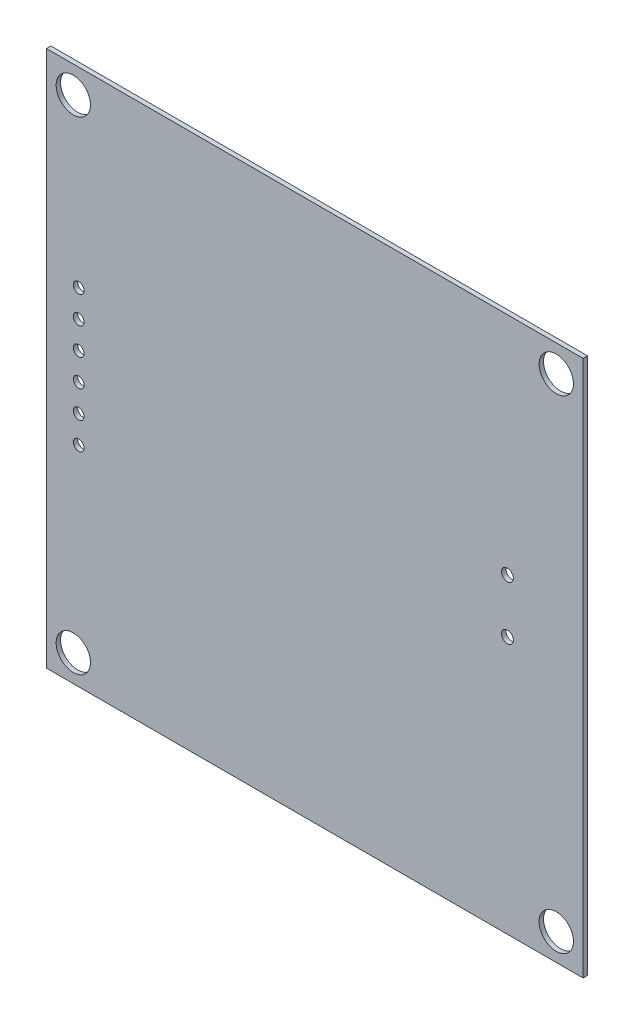
ISO-10303-21;
HEADER;
FILE_DESCRIPTION(('STEP AP214'),'2;1');
FILE_NAME('part.step','',(''),(''),'','','');
FILE_SCHEMA(('AUTOMOTIVE_DESIGN { 1 0 10303 214 1 1 1 1 }'));
ENDSEC;
DATA;
#1=APPLICATION_CONTEXT('core data for automotive mechanical design processes');
#2=APPLICATION_PROTOCOL_DEFINITION('international standard','automotive_design',2000,#1);
#3=PRODUCT_CONTEXT('',#1,'mechanical');
#4=PRODUCT('Part','Part','',(#3));
#5=PRODUCT_RELATED_PRODUCT_CATEGORY('part','',(#4));
#6=PRODUCT_DEFINITION_FORMATION('','',#4);
#7=PRODUCT_DEFINITION_CONTEXT('part definition',#1,'design');
#8=PRODUCT_DEFINITION('design','',#6,#7);
#9=PRODUCT_DEFINITION_SHAPE('','',#8);
#10=(LENGTH_UNIT() NAMED_UNIT(*) SI_UNIT(.MILLI.,.METRE.));
#11=(NAMED_UNIT(*) PLANE_ANGLE_UNIT() SI_UNIT($,.RADIAN.));
#12=(NAMED_UNIT(*) SI_UNIT($,.STERADIAN.) SOLID_ANGLE_UNIT());
#13=UNCERTAINTY_MEASURE_WITH_UNIT(LENGTH_MEASURE(1.E-05),#10,'distance_accuracy_value','');
#14=(GEOMETRIC_REPRESENTATION_CONTEXT(3) GLOBAL_UNCERTAINTY_ASSIGNED_CONTEXT((#13)) GLOBAL_UNIT_ASSIGNED_CONTEXT((#10,
#11,#12)) REPRESENTATION_CONTEXT('',''));
#15=CARTESIAN_POINT('',(0.,0.,0.));
#16=DIRECTION('',(0.,0.,1.));
#17=DIRECTION('',(1.,0.,0.));
#18=AXIS2_PLACEMENT_3D('',#15,#16,#17);
#19=CARTESIAN_POINT('',(27.50000088,27.50000088,0.41148));
#20=DIRECTION('',(0.,0.,-1.));
#21=DIRECTION('',(-1.,0.,0.));
#22=AXIS2_PLACEMENT_3D('',#19,#20,#21);
#23=PLANE('',#22);
#24=CARTESIAN_POINT('',(75.0000024,75.0000024,0.41148));
#25=DIRECTION('',(0.,0.,-1.));
#26=DIRECTION('',(-1.,0.,0.));
#27=AXIS2_PLACEMENT_3D('',#24,#25,#26);
#28=CIRCLE('',#27,1.59999934);
#29=CARTESIAN_POINT('',(73.40000306,75.0000024,0.41148));
#30=VERTEX_POINT('',#29);
#31=EDGE_CURVE('E115',#30,#30,#28,.T.);
#32=ORIENTED_EDGE('',*,*,#31,.T.);
#33=EDGE_LOOP('',(#32));
#34=FACE_BOUND('',#33,.T.);
#35=CARTESIAN_POINT('',(70.4499988,56.500014,0.41148));
#36=DIRECTION('',(0.,0.,-1.));
#37=DIRECTION('',(-1.,0.,0.));
#38=AXIS2_PLACEMENT_3D('',#35,#36,#37);
#39=CIRCLE('',#38,0.5499989);
#40=CARTESIAN_POINT('',(69.8999999,56.500014,0.41148));
#41=VERTEX_POINT('',#40);
#42=EDGE_CURVE('E119',#41,#41,#39,.T.);
#43=ORIENTED_EDGE('',*,*,#42,.T.);
#44=EDGE_LOOP('',(#43));
#45=FACE_BOUND('',#44,.T.);
#46=CARTESIAN_POINT('',(30.5000152,52.0800076,0.41148));
#47=DIRECTION('',(0.,0.,-1.));
#48=DIRECTION('',(-1.,0.,0.));
#49=AXIS2_PLACEMENT_3D('',#46,#47,#48);
#50=CIRCLE('',#49,0.499999);
#51=CARTESIAN_POINT('',(30.0000162,52.0800076,0.41148));
#52=VERTEX_POINT('',#51);
#53=EDGE_CURVE('E122',#52,#52,#50,.T.);
#54=ORIENTED_EDGE('',*,*,#53,.T.);
#55=EDGE_LOOP('',(#54));
#56=FACE_BOUND('',#55,.T.);
#57=CARTESIAN_POINT('',(70.4499988,51.500024,0.41148));
#58=DIRECTION('',(0.,0.,-1.));
#59=DIRECTION('',(-1.,0.,0.));
#60=AXIS2_PLACEMENT_3D('',#57,#58,#59);
#61=CIRCLE('',#60,0.5499989);
#62=CARTESIAN_POINT('',(69.8999999,51.500024,0.41148));
#63=VERTEX_POINT('',#62);
#64=EDGE_CURVE('E125',#63,#63,#61,.T.);
#65=ORIENTED_EDGE('',*,*,#64,.T.);
#66=EDGE_LOOP('',(#65));
#67=FACE_BOUND('',#66,.T.);
#68=CARTESIAN_POINT('',(75.0000024,29.9999908,0.41148));
#69=DIRECTION('',(0.,0.,-1.));
#70=DIRECTION('',(-1.,0.,0.));
#71=AXIS2_PLACEMENT_3D('',#68,#69,#70);
#72=CIRCLE('',#71,1.59999934);
#73=CARTESIAN_POINT('',(73.40000306,29.9999908,0.41148));
#74=VERTEX_POINT('',#73);
#75=EDGE_CURVE('E128',#74,#74,#72,.T.);
#76=ORIENTED_EDGE('',*,*,#75,.T.);
#77=EDGE_LOOP('',(#76));
#78=FACE_BOUND('',#77,.T.);
#79=CARTESIAN_POINT('',(30.5000152,47.0000076,0.41148));
#80=DIRECTION('',(0.,0.,-1.));
#81=DIRECTION('',(-1.,0.,0.));
#82=AXIS2_PLACEMENT_3D('',#79,#80,#81);
#83=CIRCLE('',#82,0.499999);
#84=CARTESIAN_POINT('',(30.0000162,47.0000076,0.41148));
#85=VERTEX_POINT('',#84);
#86=EDGE_CURVE('E131',#85,#85,#83,.T.);
#87=ORIENTED_EDGE('',*,*,#86,.T.);
#88=EDGE_LOOP('',(#87));
#89=FACE_BOUND('',#88,.T.);
#90=CARTESIAN_POINT('',(29.9999908,75.0000024,0.41148));
#91=DIRECTION('',(0.,0.,-1.));
#92=DIRECTION('',(-1.,0.,0.));
#93=AXIS2_PLACEMENT_3D('',#90,#91,#92);
#94=CIRCLE('',#93,1.59999934);
#95=CARTESIAN_POINT('',(28.39999146,75.0000024,0.41148));
#96=VERTEX_POINT('',#95);
#97=EDGE_CURVE('E134',#96,#96,#94,.T.);
#98=ORIENTED_EDGE('',*,*,#97,.T.);
#99=EDGE_LOOP('',(#98));
#100=FACE_BOUND('',#99,.T.);
#101=CARTESIAN_POINT('',(30.5000152,59.7000076,0.41148));
#102=DIRECTION('',(0.,0.,-1.));
#103=DIRECTION('',(-1.,0.,0.));
#104=AXIS2_PLACEMENT_3D('',#101,#102,#103);
#105=CIRCLE('',#104,0.499999);
#106=CARTESIAN_POINT('',(30.0000162,59.7000076,0.41148));
#107=VERTEX_POINT('',#106);
#108=EDGE_CURVE('E137',#107,#107,#105,.T.);
#109=ORIENTED_EDGE('',*,*,#108,.T.);
#110=EDGE_LOOP('',(#109));
#111=FACE_BOUND('',#110,.T.);
#112=CARTESIAN_POINT('',(30.5000152,57.1600076,0.41148));
#113=DIRECTION('',(0.,0.,-1.));
#114=DIRECTION('',(-1.,0.,0.));
#115=AXIS2_PLACEMENT_3D('',#112,#113,#114);
#116=CIRCLE('',#115,0.499999);
#117=CARTESIAN_POINT('',(30.0000162,57.1600076,0.41148));
#118=VERTEX_POINT('',#117);
#119=EDGE_CURVE('E140',#118,#118,#116,.T.);
#120=ORIENTED_EDGE('',*,*,#119,.T.);
#121=EDGE_LOOP('',(#120));
#122=FACE_BOUND('',#121,.T.);
#123=CARTESIAN_POINT('',(30.5000152,49.5400076,0.41148));
#124=DIRECTION('',(0.,0.,-1.));
#125=DIRECTION('',(-1.,0.,0.));
#126=AXIS2_PLACEMENT_3D('',#123,#124,#125);
#127=CIRCLE('',#126,0.499999);
#128=CARTESIAN_POINT('',(30.0000162,49.5400076,0.41148));
#129=VERTEX_POINT('',#128);
#130=EDGE_CURVE('E143',#129,#129,#127,.T.);
#131=ORIENTED_EDGE('',*,*,#130,.T.);
#132=EDGE_LOOP('',(#131));
#133=FACE_BOUND('',#132,.T.);
#134=CARTESIAN_POINT('',(29.9999908,29.9999908,0.41148));
#135=DIRECTION('',(0.,0.,-1.));
#136=DIRECTION('',(-1.,0.,0.));
#137=AXIS2_PLACEMENT_3D('',#134,#135,#136);
#138=CIRCLE('',#137,1.59999934);
#139=CARTESIAN_POINT('',(28.39999146,29.9999908,0.41148));
#140=VERTEX_POINT('',#139);
#141=EDGE_CURVE('E145',#140,#140,#138,.T.);
#142=ORIENTED_EDGE('',*,*,#141,.T.);
#143=EDGE_LOOP('',(#142));
#144=FACE_BOUND('',#143,.T.);
#145=CARTESIAN_POINT('',(30.5000152,54.6200076,0.41148));
#146=DIRECTION('',(0.,0.,-1.));
#147=DIRECTION('',(-1.,0.,0.));
#148=AXIS2_PLACEMENT_3D('',#145,#146,#147);
#149=CIRCLE('',#148,0.499999);
#150=CARTESIAN_POINT('',(30.0000162,54.6200076,0.41148));
#151=VERTEX_POINT('',#150);
#152=EDGE_CURVE('E20',#151,#151,#149,.T.);
#153=ORIENTED_EDGE('',*,*,#152,.T.);
#154=EDGE_LOOP('',(#153));
#155=FACE_BOUND('',#154,.T.);
#156=DIRECTION('',(0.,1.,0.));
#157=VECTOR('',#156,1.);
#158=CARTESIAN_POINT('',(77.49999994,27.50000088,0.41148));
#159=LINE('',#158,#157);
#160=CARTESIAN_POINT('',(77.49999994,27.50000088,0.41148));
#161=VERTEX_POINT('',#160);
#162=CARTESIAN_POINT('',(77.49999994,77.49999994,0.41148));
#163=VERTEX_POINT('',#162);
#164=EDGE_CURVE('E55',#161,#163,#159,.T.);
#165=ORIENTED_EDGE('',*,*,#164,.T.);
#166=DIRECTION('',(1.,0.,0.));
#167=VECTOR('',#166,1.);
#168=CARTESIAN_POINT('',(77.49999994,77.49999994,0.41148));
#169=LINE('',#168,#167);
#170=CARTESIAN_POINT('',(27.50000088,77.49999994,0.41148));
#171=VERTEX_POINT('',#170);
#172=EDGE_CURVE('E57',#163,#171,#169,.F.);
#173=ORIENTED_EDGE('',*,*,#172,.T.);
#174=DIRECTION('',(0.,1.,0.));
#175=VECTOR('',#174,1.);
#176=CARTESIAN_POINT('',(27.50000088,77.49999994,0.41148));
#177=LINE('',#176,#175);
#178=CARTESIAN_POINT('',(27.50000088,27.50000088,0.41148));
#179=VERTEX_POINT('',#178);
#180=EDGE_CURVE('E59',#171,#179,#177,.F.);
#181=ORIENTED_EDGE('',*,*,#180,.T.);
#182=DIRECTION('',(1.,0.,0.));
#183=VECTOR('',#182,1.);
#184=CARTESIAN_POINT('',(27.50000088,27.50000088,0.41148));
#185=LINE('',#184,#183);
#186=EDGE_CURVE('E152',#179,#161,#185,.T.);
#187=ORIENTED_EDGE('',*,*,#186,.T.);
#188=EDGE_LOOP('',(#165,#173,#181,#187));
#189=FACE_BOUND('',#188,.T.);
#190=ADVANCED_FACE('F17',(#34,#45,#56,#67,#78,#89,#100,#111,#122,#133,#144,#155,#189),#23,.F.);
#191=CARTESIAN_POINT('',(27.50000088,77.49999994,0.));
#192=DIRECTION('',(1.,0.,0.));
#193=DIRECTION('',(0.,0.,-1.));
#194=AXIS2_PLACEMENT_3D('',#191,#192,#193);
#195=PLANE('',#194);
#196=DIRECTION('',(0.,0.,1.));
#197=VECTOR('',#196,1.);
#198=CARTESIAN_POINT('',(27.50000088,27.50000088,0.));
#199=LINE('',#198,#197);
#200=CARTESIAN_POINT('',(27.50000088,27.50000088,0.));
#201=VERTEX_POINT('',#200);
#202=EDGE_CURVE('E70',#201,#179,#199,.T.);
#203=ORIENTED_EDGE('',*,*,#202,.T.);
#204=ORIENTED_EDGE('',*,*,#180,.F.);
#205=DIRECTION('',(0.,0.,-1.));
#206=VECTOR('',#205,1.);
#207=CARTESIAN_POINT('',(27.50000088,77.49999994,0.));
#208=LINE('',#207,#206);
#209=CARTESIAN_POINT('',(27.50000088,77.49999994,0.));
#210=VERTEX_POINT('',#209);
#211=EDGE_CURVE('E64',#171,#210,#208,.T.);
#212=ORIENTED_EDGE('',*,*,#211,.T.);
#213=DIRECTION('',(0.,1.,0.));
#214=VECTOR('',#213,1.);
#215=CARTESIAN_POINT('',(27.50000088,27.50000088,0.));
#216=LINE('',#215,#214);
#217=EDGE_CURVE('E118',#201,#210,#216,.T.);
#218=ORIENTED_EDGE('',*,*,#217,.F.);
#219=EDGE_LOOP('',(#203,#204,#212,#218));
#220=FACE_BOUND('',#219,.T.);
#221=ADVANCED_FACE('F67',(#220),#195,.F.);
#222=CARTESIAN_POINT('',(77.49999994,77.49999994,0.));
#223=DIRECTION('',(0.,-1.,0.));
#224=DIRECTION('',(0.,0.,-1.));
#225=AXIS2_PLACEMENT_3D('',#222,#223,#224);
#226=PLANE('',#225);
#227=ORIENTED_EDGE('',*,*,#211,.F.);
#228=ORIENTED_EDGE('',*,*,#172,.F.);
#229=DIRECTION('',(0.,0.,1.));
#230=VECTOR('',#229,1.);
#231=CARTESIAN_POINT('',(77.49999994,77.49999994,0.));
#232=LINE('',#231,#230);
#233=CARTESIAN_POINT('',(77.49999994,77.49999994,0.));
#234=VERTEX_POINT('',#233);
#235=EDGE_CURVE('E78',#163,#234,#232,.F.);
#236=ORIENTED_EDGE('',*,*,#235,.T.);
#237=DIRECTION('',(-1.,0.,0.));
#238=VECTOR('',#237,1.);
#239=CARTESIAN_POINT('',(27.50000088,77.49999994,0.));
#240=LINE('',#239,#238);
#241=EDGE_CURVE('E75',#210,#234,#240,.F.);
#242=ORIENTED_EDGE('',*,*,#241,.F.);
#243=EDGE_LOOP('',(#227,#228,#236,#242));
#244=FACE_BOUND('',#243,.T.);
#245=ADVANCED_FACE('F73',(#244),#226,.F.);
#246=CARTESIAN_POINT('',(77.49999994,27.50000088,0.));
#247=DIRECTION('',(-1.,0.,0.));
#248=DIRECTION('',(0.,0.,1.));
#249=AXIS2_PLACEMENT_3D('',#246,#247,#248);
#250=PLANE('',#249);
#251=ORIENTED_EDGE('',*,*,#235,.F.);
#252=ORIENTED_EDGE('',*,*,#164,.F.);
#253=DIRECTION('',(0.,0.,1.));
#254=VECTOR('',#253,1.);
#255=CARTESIAN_POINT('',(77.49999994,27.50000088,0.));
#256=LINE('',#255,#254);
#257=CARTESIAN_POINT('',(77.49999994,27.50000088,0.));
#258=VERTEX_POINT('',#257);
#259=EDGE_CURVE('E35',#161,#258,#256,.F.);
#260=ORIENTED_EDGE('',*,*,#259,.T.);
#261=DIRECTION('',(0.,1.,0.));
#262=VECTOR('',#261,1.);
#263=CARTESIAN_POINT('',(77.49999994,27.50000088,0.));
#264=LINE('',#263,#262);
#265=EDGE_CURVE('E159',#234,#258,#264,.F.);
#266=ORIENTED_EDGE('',*,*,#265,.F.);
#267=EDGE_LOOP('',(#251,#252,#260,#266));
#268=FACE_BOUND('',#267,.T.);
#269=ADVANCED_FACE('F160',(#268),#250,.F.);
#270=CARTESIAN_POINT('',(27.50000088,27.50000088,0.));
#271=DIRECTION('',(0.,1.,0.));
#272=DIRECTION('',(0.,0.,1.));
#273=AXIS2_PLACEMENT_3D('',#270,#271,#272);
#274=PLANE('',#273);
#275=ORIENTED_EDGE('',*,*,#259,.F.);
#276=ORIENTED_EDGE('',*,*,#186,.F.);
#277=ORIENTED_EDGE('',*,*,#202,.F.);
#278=DIRECTION('',(-1.,0.,0.));
#279=VECTOR('',#278,1.);
#280=CARTESIAN_POINT('',(27.50000088,27.50000088,0.));
#281=LINE('',#280,#279);
#282=EDGE_CURVE('E114',#258,#201,#281,.T.);
#283=ORIENTED_EDGE('',*,*,#282,.F.);
#284=EDGE_LOOP('',(#275,#276,#277,#283));
#285=FACE_BOUND('',#284,.T.);
#286=ADVANCED_FACE('F167',(#285),#274,.F.);
#287=CARTESIAN_POINT('',(30.5000152,54.6200076,0.));
#288=DIRECTION('',(0.,0.,-1.));
#289=DIRECTION('',(-1.,0.,0.));
#290=AXIS2_PLACEMENT_3D('',#287,#288,#289);
#291=CYLINDRICAL_SURFACE('',#290,0.499999);
#292=ORIENTED_EDGE('',*,*,#152,.F.);
#293=EDGE_LOOP('',(#292));
#294=FACE_BOUND('',#293,.T.);
#295=CARTESIAN_POINT('',(30.5000152,54.6200076,0.));
#296=DIRECTION('',(0.,0.,-1.));
#297=DIRECTION('',(-1.,0.,0.));
#298=AXIS2_PLACEMENT_3D('',#295,#296,#297);
#299=CIRCLE('',#298,0.499999);
#300=CARTESIAN_POINT('',(30.0000162,54.6200076,0.));
#301=VERTEX_POINT('',#300);
#302=EDGE_CURVE('E111',#301,#301,#299,.F.);
#303=ORIENTED_EDGE('',*,*,#302,.F.);
#304=EDGE_LOOP('',(#303));
#305=FACE_BOUND('',#304,.T.);
#306=ADVANCED_FACE('F169',(#294,#305),#291,.F.);
#307=CARTESIAN_POINT('',(29.9999908,29.9999908,0.));
#308=DIRECTION('',(0.,0.,-1.));
#309=DIRECTION('',(-1.,0.,0.));
#310=AXIS2_PLACEMENT_3D('',#307,#308,#309);
#311=CYLINDRICAL_SURFACE('',#310,1.59999934);
#312=ORIENTED_EDGE('',*,*,#141,.F.);
#313=EDGE_LOOP('',(#312));
#314=FACE_BOUND('',#313,.T.);
#315=CARTESIAN_POINT('',(29.9999908,29.9999908,0.));
#316=DIRECTION('',(0.,0.,-1.));
#317=DIRECTION('',(-1.,0.,0.));
#318=AXIS2_PLACEMENT_3D('',#315,#316,#317);
#319=CIRCLE('',#318,1.59999934);
#320=CARTESIAN_POINT('',(28.39999146,29.9999908,0.));
#321=VERTEX_POINT('',#320);
#322=EDGE_CURVE('E108',#321,#321,#319,.F.);
#323=ORIENTED_EDGE('',*,*,#322,.F.);
#324=EDGE_LOOP('',(#323));
#325=FACE_BOUND('',#324,.T.);
#326=ADVANCED_FACE('F176',(#314,#325),#311,.F.);
#327=CARTESIAN_POINT('',(30.5000152,49.5400076,0.));
#328=DIRECTION('',(0.,0.,-1.));
#329=DIRECTION('',(-1.,0.,0.));
#330=AXIS2_PLACEMENT_3D('',#327,#328,#329);
#331=CYLINDRICAL_SURFACE('',#330,0.499999);
#332=ORIENTED_EDGE('',*,*,#130,.F.);
#333=EDGE_LOOP('',(#332));
#334=FACE_BOUND('',#333,.T.);
#335=CARTESIAN_POINT('',(30.5000152,49.5400076,0.));
#336=DIRECTION('',(0.,0.,-1.));
#337=DIRECTION('',(-1.,0.,0.));
#338=AXIS2_PLACEMENT_3D('',#335,#336,#337);
#339=CIRCLE('',#338,0.499999);
#340=CARTESIAN_POINT('',(30.0000162,49.5400076,0.));
#341=VERTEX_POINT('',#340);
#342=EDGE_CURVE('E105',#341,#341,#339,.F.);
#343=ORIENTED_EDGE('',*,*,#342,.F.);
#344=EDGE_LOOP('',(#343));
#345=FACE_BOUND('',#344,.T.);
#346=ADVANCED_FACE('F222',(#334,#345),#331,.F.);
#347=CARTESIAN_POINT('',(30.5000152,57.1600076,0.));
#348=DIRECTION('',(0.,0.,-1.));
#349=DIRECTION('',(-1.,0.,0.));
#350=AXIS2_PLACEMENT_3D('',#347,#348,#349);
#351=CYLINDRICAL_SURFACE('',#350,0.499999);
#352=ORIENTED_EDGE('',*,*,#119,.F.);
#353=EDGE_LOOP('',(#352));
#354=FACE_BOUND('',#353,.T.);
#355=CARTESIAN_POINT('',(30.5000152,57.1600076,0.));
#356=DIRECTION('',(0.,0.,-1.));
#357=DIRECTION('',(-1.,0.,0.));
#358=AXIS2_PLACEMENT_3D('',#355,#356,#357);
#359=CIRCLE('',#358,0.499999);
#360=CARTESIAN_POINT('',(30.0000162,57.1600076,0.));
#361=VERTEX_POINT('',#360);
#362=EDGE_CURVE('E102',#361,#361,#359,.F.);
#363=ORIENTED_EDGE('',*,*,#362,.F.);
#364=EDGE_LOOP('',(#363));
#365=FACE_BOUND('',#364,.T.);
#366=ADVANCED_FACE('F218',(#354,#365),#351,.F.);
#367=CARTESIAN_POINT('',(30.5000152,59.7000076,0.));
#368=DIRECTION('',(0.,0.,-1.));
#369=DIRECTION('',(-1.,0.,0.));
#370=AXIS2_PLACEMENT_3D('',#367,#368,#369);
#371=CYLINDRICAL_SURFACE('',#370,0.499999);
#372=ORIENTED_EDGE('',*,*,#108,.F.);
#373=EDGE_LOOP('',(#372));
#374=FACE_BOUND('',#373,.T.);
#375=CARTESIAN_POINT('',(30.5000152,59.7000076,0.));
#376=DIRECTION('',(0.,0.,-1.));
#377=DIRECTION('',(-1.,0.,0.));
#378=AXIS2_PLACEMENT_3D('',#375,#376,#377);
#379=CIRCLE('',#378,0.499999);
#380=CARTESIAN_POINT('',(30.0000162,59.7000076,0.));
#381=VERTEX_POINT('',#380);
#382=EDGE_CURVE('E99',#381,#381,#379,.F.);
#383=ORIENTED_EDGE('',*,*,#382,.F.);
#384=EDGE_LOOP('',(#383));
#385=FACE_BOUND('',#384,.T.);
#386=ADVANCED_FACE('F214',(#374,#385),#371,.F.);
#387=CARTESIAN_POINT('',(29.9999908,75.0000024,0.));
#388=DIRECTION('',(0.,0.,-1.));
#389=DIRECTION('',(-1.,0.,0.));
#390=AXIS2_PLACEMENT_3D('',#387,#388,#389);
#391=CYLINDRICAL_SURFACE('',#390,1.59999934);
#392=ORIENTED_EDGE('',*,*,#97,.F.);
#393=EDGE_LOOP('',(#392));
#394=FACE_BOUND('',#393,.T.);
#395=CARTESIAN_POINT('',(29.9999908,75.0000024,0.));
#396=DIRECTION('',(0.,0.,-1.));
#397=DIRECTION('',(-1.,0.,0.));
#398=AXIS2_PLACEMENT_3D('',#395,#396,#397);
#399=CIRCLE('',#398,1.59999934);
#400=CARTESIAN_POINT('',(28.39999146,75.0000024,0.));
#401=VERTEX_POINT('',#400);
#402=EDGE_CURVE('E96',#401,#401,#399,.F.);
#403=ORIENTED_EDGE('',*,*,#402,.F.);
#404=EDGE_LOOP('',(#403));
#405=FACE_BOUND('',#404,.T.);
#406=ADVANCED_FACE('F210',(#394,#405),#391,.F.);
#407=CARTESIAN_POINT('',(30.5000152,47.0000076,0.));
#408=DIRECTION('',(0.,0.,-1.));
#409=DIRECTION('',(-1.,0.,0.));
#410=AXIS2_PLACEMENT_3D('',#407,#408,#409);
#411=CYLINDRICAL_SURFACE('',#410,0.499999);
#412=ORIENTED_EDGE('',*,*,#86,.F.);
#413=EDGE_LOOP('',(#412));
#414=FACE_BOUND('',#413,.T.);
#415=CARTESIAN_POINT('',(30.5000152,47.0000076,0.));
#416=DIRECTION('',(0.,0.,-1.));
#417=DIRECTION('',(-1.,0.,0.));
#418=AXIS2_PLACEMENT_3D('',#415,#416,#417);
#419=CIRCLE('',#418,0.499999);
#420=CARTESIAN_POINT('',(30.0000162,47.0000076,0.));
#421=VERTEX_POINT('',#420);
#422=EDGE_CURVE('E93',#421,#421,#419,.F.);
#423=ORIENTED_EDGE('',*,*,#422,.F.);
#424=EDGE_LOOP('',(#423));
#425=FACE_BOUND('',#424,.T.);
#426=ADVANCED_FACE('F206',(#414,#425),#411,.F.);
#427=CARTESIAN_POINT('',(75.0000024,29.9999908,0.));
#428=DIRECTION('',(0.,0.,-1.));
#429=DIRECTION('',(-1.,0.,0.));
#430=AXIS2_PLACEMENT_3D('',#427,#428,#429);
#431=CYLINDRICAL_SURFACE('',#430,1.59999934);
#432=ORIENTED_EDGE('',*,*,#75,.F.);
#433=EDGE_LOOP('',(#432));
#434=FACE_BOUND('',#433,.T.);
#435=CARTESIAN_POINT('',(75.0000024,29.9999908,0.));
#436=DIRECTION('',(0.,0.,-1.));
#437=DIRECTION('',(-1.,0.,0.));
#438=AXIS2_PLACEMENT_3D('',#435,#436,#437);
#439=CIRCLE('',#438,1.59999934);
#440=CARTESIAN_POINT('',(73.40000306,29.9999908,0.));
#441=VERTEX_POINT('',#440);
#442=EDGE_CURVE('E90',#441,#441,#439,.F.);
#443=ORIENTED_EDGE('',*,*,#442,.F.);
#444=EDGE_LOOP('',(#443));
#445=FACE_BOUND('',#444,.T.);
#446=ADVANCED_FACE('F202',(#434,#445),#431,.F.);
#447=CARTESIAN_POINT('',(70.4499988,51.500024,0.));
#448=DIRECTION('',(0.,0.,-1.));
#449=DIRECTION('',(-1.,0.,0.));
#450=AXIS2_PLACEMENT_3D('',#447,#448,#449);
#451=CYLINDRICAL_SURFACE('',#450,0.5499989);
#452=ORIENTED_EDGE('',*,*,#64,.F.);
#453=EDGE_LOOP('',(#452));
#454=FACE_BOUND('',#453,.T.);
#455=CARTESIAN_POINT('',(70.4499988,51.500024,0.));
#456=DIRECTION('',(0.,0.,-1.));
#457=DIRECTION('',(-1.,0.,0.));
#458=AXIS2_PLACEMENT_3D('',#455,#456,#457);
#459=CIRCLE('',#458,0.5499989);
#460=CARTESIAN_POINT('',(69.8999999,51.500024,0.));
#461=VERTEX_POINT('',#460);
#462=EDGE_CURVE('E87',#461,#461,#459,.F.);
#463=ORIENTED_EDGE('',*,*,#462,.F.);
#464=EDGE_LOOP('',(#463));
#465=FACE_BOUND('',#464,.T.);
#466=ADVANCED_FACE('F198',(#454,#465),#451,.F.);
#467=CARTESIAN_POINT('',(30.5000152,52.0800076,0.));
#468=DIRECTION('',(0.,0.,-1.));
#469=DIRECTION('',(-1.,0.,0.));
#470=AXIS2_PLACEMENT_3D('',#467,#468,#469);
#471=CYLINDRICAL_SURFACE('',#470,0.499999);
#472=ORIENTED_EDGE('',*,*,#53,.F.);
#473=EDGE_LOOP('',(#472));
#474=FACE_BOUND('',#473,.T.);
#475=CARTESIAN_POINT('',(30.5000152,52.0800076,0.));
#476=DIRECTION('',(0.,0.,-1.));
#477=DIRECTION('',(-1.,0.,0.));
#478=AXIS2_PLACEMENT_3D('',#475,#476,#477);
#479=CIRCLE('',#478,0.499999);
#480=CARTESIAN_POINT('',(30.0000162,52.0800076,0.));
#481=VERTEX_POINT('',#480);
#482=EDGE_CURVE('E84',#481,#481,#479,.F.);
#483=ORIENTED_EDGE('',*,*,#482,.F.);
#484=EDGE_LOOP('',(#483));
#485=FACE_BOUND('',#484,.T.);
#486=ADVANCED_FACE('F194',(#474,#485),#471,.F.);
#487=CARTESIAN_POINT('',(70.4499988,56.500014,0.));
#488=DIRECTION('',(0.,0.,-1.));
#489=DIRECTION('',(-1.,0.,0.));
#490=AXIS2_PLACEMENT_3D('',#487,#488,#489);
#491=CYLINDRICAL_SURFACE('',#490,0.5499989);
#492=ORIENTED_EDGE('',*,*,#42,.F.);
#493=EDGE_LOOP('',(#492));
#494=FACE_BOUND('',#493,.T.);
#495=CARTESIAN_POINT('',(70.4499988,56.500014,0.));
#496=DIRECTION('',(0.,0.,-1.));
#497=DIRECTION('',(-1.,0.,0.));
#498=AXIS2_PLACEMENT_3D('',#495,#496,#497);
#499=CIRCLE('',#498,0.5499989);
#500=CARTESIAN_POINT('',(69.8999999,56.500014,0.));
#501=VERTEX_POINT('',#500);
#502=EDGE_CURVE('E26',#501,#501,#499,.F.);
#503=ORIENTED_EDGE('',*,*,#502,.F.);
#504=EDGE_LOOP('',(#503));
#505=FACE_BOUND('',#504,.T.);
#506=ADVANCED_FACE('F187',(#494,#505),#491,.F.);
#507=CARTESIAN_POINT('',(75.0000024,75.0000024,0.));
#508=DIRECTION('',(0.,0.,-1.));
#509=DIRECTION('',(-1.,0.,0.));
#510=AXIS2_PLACEMENT_3D('',#507,#508,#509);
#511=CYLINDRICAL_SURFACE('',#510,1.59999934);
#512=ORIENTED_EDGE('',*,*,#31,.F.);
#513=EDGE_LOOP('',(#512));
#514=FACE_BOUND('',#513,.T.);
#515=CARTESIAN_POINT('',(75.0000024,75.0000024,0.));
#516=DIRECTION('',(0.,0.,-1.));
#517=DIRECTION('',(-1.,0.,0.));
#518=AXIS2_PLACEMENT_3D('',#515,#516,#517);
#519=CIRCLE('',#518,1.59999934);
#520=CARTESIAN_POINT('',(73.40000306,75.0000024,0.));
#521=VERTEX_POINT('',#520);
#522=EDGE_CURVE('E11',#521,#521,#519,.F.);
#523=ORIENTED_EDGE('',*,*,#522,.F.);
#524=EDGE_LOOP('',(#523));
#525=FACE_BOUND('',#524,.T.);
#526=ADVANCED_FACE('F181',(#514,#525),#511,.F.);
#527=CARTESIAN_POINT('',(27.50000088,27.50000088,0.));
#528=DIRECTION('',(0.,0.,-1.));
#529=DIRECTION('',(-1.,0.,0.));
#530=AXIS2_PLACEMENT_3D('',#527,#528,#529);
#531=PLANE('',#530);
#532=ORIENTED_EDGE('',*,*,#522,.T.);
#533=EDGE_LOOP('',(#532));
#534=FACE_BOUND('',#533,.T.);
#535=ORIENTED_EDGE('',*,*,#502,.T.);
#536=EDGE_LOOP('',(#535));
#537=FACE_BOUND('',#536,.T.);
#538=ORIENTED_EDGE('',*,*,#482,.T.);
#539=EDGE_LOOP('',(#538));
#540=FACE_BOUND('',#539,.T.);
#541=ORIENTED_EDGE('',*,*,#462,.T.);
#542=EDGE_LOOP('',(#541));
#543=FACE_BOUND('',#542,.T.);
#544=ORIENTED_EDGE('',*,*,#442,.T.);
#545=EDGE_LOOP('',(#544));
#546=FACE_BOUND('',#545,.T.);
#547=ORIENTED_EDGE('',*,*,#422,.T.);
#548=EDGE_LOOP('',(#547));
#549=FACE_BOUND('',#548,.T.);
#550=ORIENTED_EDGE('',*,*,#402,.T.);
#551=EDGE_LOOP('',(#550));
#552=FACE_BOUND('',#551,.T.);
#553=ORIENTED_EDGE('',*,*,#382,.T.);
#554=EDGE_LOOP('',(#553));
#555=FACE_BOUND('',#554,.T.);
#556=ORIENTED_EDGE('',*,*,#362,.T.);
#557=EDGE_LOOP('',(#556));
#558=FACE_BOUND('',#557,.T.);
#559=ORIENTED_EDGE('',*,*,#342,.T.);
#560=EDGE_LOOP('',(#559));
#561=FACE_BOUND('',#560,.T.);
#562=ORIENTED_EDGE('',*,*,#322,.T.);
#563=EDGE_LOOP('',(#562));
#564=FACE_BOUND('',#563,.T.);
#565=ORIENTED_EDGE('',*,*,#302,.T.);
#566=EDGE_LOOP('',(#565));
#567=FACE_BOUND('',#566,.T.);
#568=ORIENTED_EDGE('',*,*,#265,.T.);
#569=ORIENTED_EDGE('',*,*,#282,.T.);
#570=ORIENTED_EDGE('',*,*,#217,.T.);
#571=ORIENTED_EDGE('',*,*,#241,.T.);
#572=EDGE_LOOP('',(#568,#569,#570,#571));
#573=FACE_BOUND('',#572,.T.);
#574=ADVANCED_FACE('F164',(#534,#537,#540,#543,#546,#549,#552,#555,#558,#561,#564,#567,#573),
#531,.T.);
#575=CLOSED_SHELL('',(#190,#221,#245,#269,#286,#306,#326,#346,#366,#386,#406,#426,#446,#466,
#486,#506,#526,#574));
#576=MANIFOLD_SOLID_BREP('B1',#575);
#577=ADVANCED_BREP_SHAPE_REPRESENTATION('',(#18,#576),#14);
#578=SHAPE_DEFINITION_REPRESENTATION(#9,#577);
ENDSEC;
END-ISO-10303-21;
